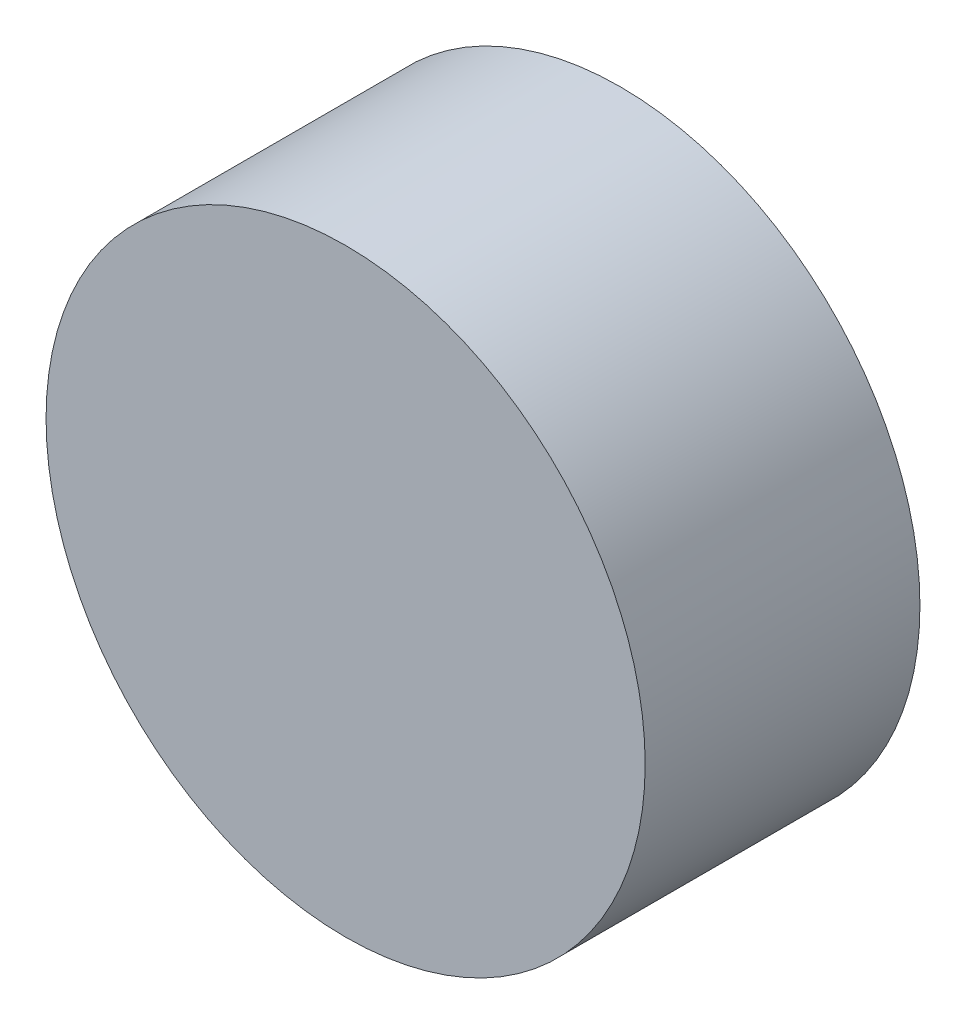
ISO-10303-21;
HEADER;
FILE_DESCRIPTION(('STEP AP214'),'2;1');
FILE_NAME('part.step','',(''),(''),'','','');
FILE_SCHEMA(('AUTOMOTIVE_DESIGN { 1 0 10303 214 1 1 1 1 }'));
ENDSEC;
DATA;
#1=APPLICATION_CONTEXT('core data for automotive mechanical design processes');
#2=APPLICATION_PROTOCOL_DEFINITION('international standard','automotive_design',2000,#1);
#3=PRODUCT_CONTEXT('',#1,'mechanical');
#4=PRODUCT('Part','Part','',(#3));
#5=PRODUCT_RELATED_PRODUCT_CATEGORY('part','',(#4));
#6=PRODUCT_DEFINITION_FORMATION('','',#4);
#7=PRODUCT_DEFINITION_CONTEXT('part definition',#1,'design');
#8=PRODUCT_DEFINITION('design','',#6,#7);
#9=PRODUCT_DEFINITION_SHAPE('','',#8);
#10=(LENGTH_UNIT() NAMED_UNIT(*) SI_UNIT(.MILLI.,.METRE.));
#11=(NAMED_UNIT(*) PLANE_ANGLE_UNIT() SI_UNIT($,.RADIAN.));
#12=(NAMED_UNIT(*) SI_UNIT($,.STERADIAN.) SOLID_ANGLE_UNIT());
#13=UNCERTAINTY_MEASURE_WITH_UNIT(LENGTH_MEASURE(1.E-05),#10,'distance_accuracy_value','');
#14=(GEOMETRIC_REPRESENTATION_CONTEXT(3) GLOBAL_UNCERTAINTY_ASSIGNED_CONTEXT((#13)) GLOBAL_UNIT_ASSIGNED_CONTEXT((#10,
#11,#12)) REPRESENTATION_CONTEXT('',''));
#15=CARTESIAN_POINT('',(0.,0.,0.));
#16=DIRECTION('',(0.,0.,1.));
#17=DIRECTION('',(1.,0.,0.));
#18=AXIS2_PLACEMENT_3D('',#15,#16,#17);
#19=CARTESIAN_POINT('',(0.,0.,6.7564));
#20=DIRECTION('',(0.,0.,-1.));
#21=DIRECTION('',(-1.,0.,0.));
#22=AXIS2_PLACEMENT_3D('',#19,#20,#21);
#23=CYLINDRICAL_SURFACE('',#22,7.366);
#24=CARTESIAN_POINT('',(0.,0.,6.7564));
#25=DIRECTION('',(0.,0.,1.));
#26=DIRECTION('',(1.,0.,0.));
#27=AXIS2_PLACEMENT_3D('',#24,#25,#26);
#28=CIRCLE('',#27,7.366);
#29=CARTESIAN_POINT('',(7.366,0.,6.7564));
#30=VERTEX_POINT('',#29);
#31=EDGE_CURVE('E10',#30,#30,#28,.T.);
#32=ORIENTED_EDGE('',*,*,#31,.F.);
#33=EDGE_LOOP('',(#32));
#34=FACE_BOUND('',#33,.T.);
#35=CARTESIAN_POINT('',(0.,0.,0.));
#36=DIRECTION('',(0.,0.,1.));
#37=DIRECTION('',(1.,0.,0.));
#38=AXIS2_PLACEMENT_3D('',#35,#36,#37);
#39=CIRCLE('',#38,7.366);
#40=CARTESIAN_POINT('',(7.366,0.,0.));
#41=VERTEX_POINT('',#40);
#42=EDGE_CURVE('E46',#41,#41,#39,.T.);
#43=ORIENTED_EDGE('',*,*,#42,.T.);
#44=EDGE_LOOP('',(#43));
#45=FACE_BOUND('',#44,.T.);
#46=ADVANCED_FACE('F43',(#34,#45),#23,.T.);
#47=CARTESIAN_POINT('',(0.,0.,6.7564));
#48=DIRECTION('',(0.,0.,1.));
#49=DIRECTION('',(1.,0.,0.));
#50=AXIS2_PLACEMENT_3D('',#47,#48,#49);
#51=PLANE('',#50);
#52=ORIENTED_EDGE('',*,*,#31,.T.);
#53=EDGE_LOOP('',(#52));
#54=FACE_BOUND('',#53,.T.);
#55=ADVANCED_FACE('F60',(#54),#51,.T.);
#56=CARTESIAN_POINT('',(0.,0.,0.));
#57=DIRECTION('',(0.,0.,1.));
#58=DIRECTION('',(1.,0.,0.));
#59=AXIS2_PLACEMENT_3D('',#56,#57,#58);
#60=PLANE('',#59);
#61=ORIENTED_EDGE('',*,*,#42,.F.);
#62=EDGE_LOOP('',(#61));
#63=FACE_BOUND('',#62,.T.);
#64=ADVANCED_FACE('F58',(#63),#60,.F.);
#65=CLOSED_SHELL('',(#46,#55,#64));
#66=MANIFOLD_SOLID_BREP('B2',#65);
#67=ADVANCED_BREP_SHAPE_REPRESENTATION('',(#18,#66),#14);
#68=SHAPE_DEFINITION_REPRESENTATION(#9,#67);
ENDSEC;
END-ISO-10303-21;
